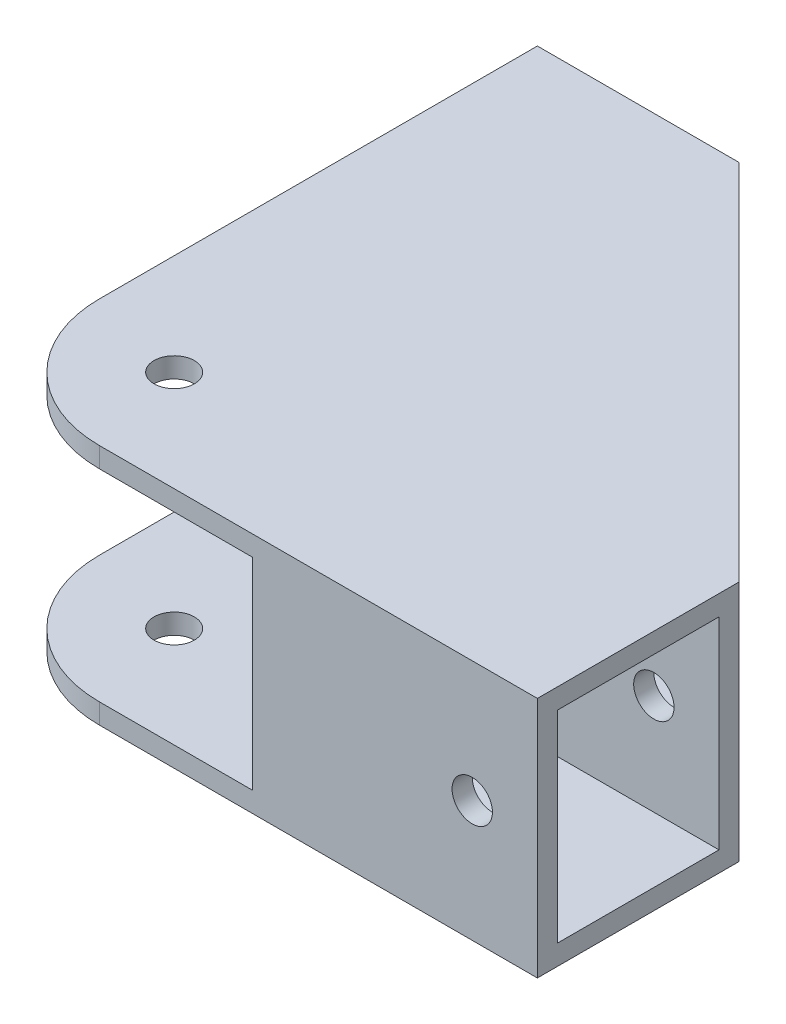
ISO-10303-21;
HEADER;
FILE_DESCRIPTION(('STEP AP214'),'2;1');
FILE_NAME('part.step','',(''),(''),'','','');
FILE_SCHEMA(('AUTOMOTIVE_DESIGN { 1 0 10303 214 1 1 1 1 }'));
ENDSEC;
DATA;
#1=APPLICATION_CONTEXT('core data for automotive mechanical design processes');
#2=APPLICATION_PROTOCOL_DEFINITION('international standard','automotive_design',2000,#1);
#3=PRODUCT_CONTEXT('',#1,'mechanical');
#4=PRODUCT('Part','Part','',(#3));
#5=PRODUCT_RELATED_PRODUCT_CATEGORY('part','',(#4));
#6=PRODUCT_DEFINITION_FORMATION('','',#4);
#7=PRODUCT_DEFINITION_CONTEXT('part definition',#1,'design');
#8=PRODUCT_DEFINITION('design','',#6,#7);
#9=PRODUCT_DEFINITION_SHAPE('','',#8);
#10=(LENGTH_UNIT() NAMED_UNIT(*) SI_UNIT(.MILLI.,.METRE.));
#11=(NAMED_UNIT(*) PLANE_ANGLE_UNIT() SI_UNIT($,.RADIAN.));
#12=(NAMED_UNIT(*) SI_UNIT($,.STERADIAN.) SOLID_ANGLE_UNIT());
#13=UNCERTAINTY_MEASURE_WITH_UNIT(LENGTH_MEASURE(1.E-05),#10,'distance_accuracy_value','');
#14=(GEOMETRIC_REPRESENTATION_CONTEXT(3) GLOBAL_UNCERTAINTY_ASSIGNED_CONTEXT((#13)) GLOBAL_UNIT_ASSIGNED_CONTEXT((#10,
#11,#12)) REPRESENTATION_CONTEXT('',''));
#15=CARTESIAN_POINT('',(0.,0.,0.));
#16=DIRECTION('',(0.,0.,1.));
#17=DIRECTION('',(1.,0.,0.));
#18=AXIS2_PLACEMENT_3D('',#15,#16,#17);
#19=CARTESIAN_POINT('',(-57.15,38.1,-31.75));
#20=DIRECTION('',(0.,0.,1.));
#21=DIRECTION('',(1.,0.,0.));
#22=AXIS2_PLACEMENT_3D('',#19,#20,#21);
#23=PLANE('',#22);
#24=CARTESIAN_POINT('',(-10.25,19.05,-31.75));
#25=DIRECTION('',(0.,0.,1.));
#26=DIRECTION('',(1.,0.,0.));
#27=AXIS2_PLACEMENT_3D('',#24,#25,#26);
#28=CIRCLE('',#27,3.175);
#29=CARTESIAN_POINT('',(-7.075,19.05,-31.75));
#30=VERTEX_POINT('',#29);
#31=EDGE_CURVE('E247',#30,#30,#28,.F.);
#32=ORIENTED_EDGE('',*,*,#31,.F.);
#33=EDGE_LOOP('',(#32));
#34=FACE_BOUND('',#33,.T.);
#35=DIRECTION('',(1.,0.,0.));
#36=VECTOR('',#35,1.);
#37=CARTESIAN_POINT('',(-57.15,3.17500000000001,-31.75));
#38=LINE('',#37,#36);
#39=CARTESIAN_POINT('',(-57.15,3.17500000000002,-31.75));
#40=VERTEX_POINT('',#39);
#41=CARTESIAN_POINT('',(0.,3.17500000000002,-31.75));
#42=VERTEX_POINT('',#41);
#43=EDGE_CURVE('E205',#40,#42,#38,.T.);
#44=ORIENTED_EDGE('',*,*,#43,.F.);
#45=DIRECTION('',(0.,-1.,0.));
#46=VECTOR('',#45,1.);
#47=CARTESIAN_POINT('',(-57.15,38.1,-31.75));
#48=LINE('',#47,#46);
#49=CARTESIAN_POINT('',(-57.15,34.925,-31.75));
#50=VERTEX_POINT('',#49);
#51=EDGE_CURVE('E197',#50,#40,#48,.T.);
#52=ORIENTED_EDGE('',*,*,#51,.F.);
#53=DIRECTION('',(1.,0.,0.));
#54=VECTOR('',#53,1.);
#55=CARTESIAN_POINT('',(-57.15,34.925,-31.75));
#56=LINE('',#55,#54);
#57=CARTESIAN_POINT('',(0.,34.925,-31.75));
#58=VERTEX_POINT('',#57);
#59=EDGE_CURVE('E182',#50,#58,#56,.T.);
#60=ORIENTED_EDGE('',*,*,#59,.T.);
#61=DIRECTION('',(0.,-1.,0.));
#62=VECTOR('',#61,1.);
#63=CARTESIAN_POINT('',(0.,38.1,-31.75));
#64=LINE('',#63,#62);
#65=EDGE_CURVE('E206',#58,#42,#64,.T.);
#66=ORIENTED_EDGE('',*,*,#65,.T.);
#67=EDGE_LOOP('',(#44,#52,#60,#66));
#68=FACE_BOUND('',#67,.T.);
#69=ADVANCED_FACE('F39',(#34,#68),#23,.F.);
#70=CARTESIAN_POINT('',(-57.15,38.1,-88.9));
#71=DIRECTION('',(-1.,0.,0.));
#72=DIRECTION('',(0.,0.,1.));
#73=AXIS2_PLACEMENT_3D('',#70,#71,#72);
#74=PLANE('',#73);
#75=CARTESIAN_POINT('',(-57.15,19.05,-78.65));
#76=DIRECTION('',(-1.,0.,0.));
#77=DIRECTION('',(0.,0.,1.));
#78=AXIS2_PLACEMENT_3D('',#75,#76,#77);
#79=CIRCLE('',#78,3.175);
#80=CARTESIAN_POINT('',(-57.15,19.05,-75.475));
#81=VERTEX_POINT('',#80);
#82=EDGE_CURVE('E242',#81,#81,#79,.F.);
#83=ORIENTED_EDGE('',*,*,#82,.F.);
#84=EDGE_LOOP('',(#83));
#85=FACE_BOUND('',#84,.T.);
#86=DIRECTION('',(0.,0.,1.));
#87=VECTOR('',#86,1.);
#88=CARTESIAN_POINT('',(-57.15,3.17500000000001,-88.9));
#89=LINE('',#88,#87);
#90=CARTESIAN_POINT('',(-57.15,3.17500000000002,-88.9));
#91=VERTEX_POINT('',#90);
#92=EDGE_CURVE('E375',#91,#40,#89,.T.);
#93=ORIENTED_EDGE('',*,*,#92,.F.);
#94=DIRECTION('',(0.,-1.,0.));
#95=VECTOR('',#94,1.);
#96=CARTESIAN_POINT('',(-57.15,38.1,-88.9));
#97=LINE('',#96,#95);
#98=CARTESIAN_POINT('',(-57.15,34.925,-88.9));
#99=VERTEX_POINT('',#98);
#100=EDGE_CURVE('E200',#99,#91,#97,.T.);
#101=ORIENTED_EDGE('',*,*,#100,.F.);
#102=DIRECTION('',(0.,0.,1.));
#103=VECTOR('',#102,1.);
#104=CARTESIAN_POINT('',(-57.15,34.925,-88.9));
#105=LINE('',#104,#103);
#106=EDGE_CURVE('E185',#99,#50,#105,.T.);
#107=ORIENTED_EDGE('',*,*,#106,.T.);
#108=ORIENTED_EDGE('',*,*,#51,.T.);
#109=EDGE_LOOP('',(#93,#101,#107,#108));
#110=FACE_BOUND('',#109,.T.);
#111=ADVANCED_FACE('F196',(#85,#110),#74,.F.);
#112=CARTESIAN_POINT('',(-129.559838907699,34.925,-3.175));
#113=DIRECTION('',(0.,0.,1.));
#114=DIRECTION('',(1.,0.,0.));
#115=AXIS2_PLACEMENT_3D('',#112,#113,#114);
#116=PLANE('',#115);
#117=CARTESIAN_POINT('',(-10.25,19.05,-3.175));
#118=DIRECTION('',(0.,0.,1.));
#119=DIRECTION('',(1.,0.,0.));
#120=AXIS2_PLACEMENT_3D('',#117,#118,#119);
#121=CIRCLE('',#120,3.175);
#122=CARTESIAN_POINT('',(-7.075,19.05,-3.175));
#123=VERTEX_POINT('',#122);
#124=EDGE_CURVE('E246',#123,#123,#121,.T.);
#125=ORIENTED_EDGE('',*,*,#124,.T.);
#126=EDGE_LOOP('',(#125));
#127=FACE_BOUND('',#126,.T.);
#128=DIRECTION('',(1.,0.,0.));
#129=VECTOR('',#128,1.);
#130=CARTESIAN_POINT('',(-129.559838907699,3.175,-3.175));
#131=LINE('',#130,#129);
#132=CARTESIAN_POINT('',(-41.6638474551887,3.175,-3.175));
#133=VERTEX_POINT('',#132);
#134=CARTESIAN_POINT('',(0.,3.175,-3.175));
#135=VERTEX_POINT('',#134);
#136=EDGE_CURVE('E335',#133,#135,#131,.T.);
#137=ORIENTED_EDGE('',*,*,#136,.F.);
#138=DIRECTION('',(0.,1.,0.));
#139=VECTOR('',#138,1.);
#140=CARTESIAN_POINT('',(-41.6638474551887,34.925,-3.175));
#141=LINE('',#140,#139);
#142=CARTESIAN_POINT('',(-41.6638474551887,34.925,-3.175));
#143=VERTEX_POINT('',#142);
#144=EDGE_CURVE('E259',#133,#143,#141,.T.);
#145=ORIENTED_EDGE('',*,*,#144,.T.);
#146=DIRECTION('',(1.,0.,0.));
#147=VECTOR('',#146,1.);
#148=CARTESIAN_POINT('',(-129.559838907699,34.925,-3.175));
#149=LINE('',#148,#147);
#150=CARTESIAN_POINT('',(0.,34.925,-3.175));
#151=VERTEX_POINT('',#150);
#152=EDGE_CURVE('E277',#143,#151,#149,.T.);
#153=ORIENTED_EDGE('',*,*,#152,.T.);
#154=DIRECTION('',(0.,-1.,0.));
#155=VECTOR('',#154,1.);
#156=CARTESIAN_POINT('',(0.,34.925,-3.175));
#157=LINE('',#156,#155);
#158=EDGE_CURVE('E323',#151,#135,#157,.T.);
#159=ORIENTED_EDGE('',*,*,#158,.T.);
#160=EDGE_LOOP('',(#137,#145,#153,#159));
#161=FACE_BOUND('',#160,.T.);
#162=ADVANCED_FACE('F443',(#127,#161),#116,.F.);
#163=CARTESIAN_POINT('',(-88.9,38.1,0.));
#164=DIRECTION('',(1.,0.,0.));
#165=DIRECTION('',(0.,0.,-1.));
#166=AXIS2_PLACEMENT_3D('',#163,#164,#165);
#167=PLANE('',#166);
#168=CARTESIAN_POINT('',(-88.9,19.05,-78.65));
#169=DIRECTION('',(-1.,0.,0.));
#170=DIRECTION('',(0.,0.,1.));
#171=AXIS2_PLACEMENT_3D('',#168,#169,#170);
#172=CIRCLE('',#171,3.175);
#173=CARTESIAN_POINT('',(-88.9,19.05,-75.475));
#174=VERTEX_POINT('',#173);
#175=EDGE_CURVE('E396',#174,#174,#172,.T.);
#176=ORIENTED_EDGE('',*,*,#175,.F.);
#177=EDGE_LOOP('',(#176));
#178=FACE_BOUND('',#177,.T.);
#179=DIRECTION('',(0.,1.,0.));
#180=VECTOR('',#179,1.);
#181=CARTESIAN_POINT('',(-88.9,0.,-44.0611525448112));
#182=LINE('',#181,#180);
#183=CARTESIAN_POINT('',(-88.9,3.175,-44.0611525448112));
#184=VERTEX_POINT('',#183);
#185=CARTESIAN_POINT('',(-88.9,34.925,-44.0611525448112));
#186=VERTEX_POINT('',#185);
#187=EDGE_CURVE('E262',#184,#186,#182,.T.);
#188=ORIENTED_EDGE('',*,*,#187,.T.);
#189=DIRECTION('',(0.,0.,-1.));
#190=VECTOR('',#189,1.);
#191=CARTESIAN_POINT('',(-88.9,34.925,-28.575));
#192=LINE('',#191,#190);
#193=CARTESIAN_POINT('',(-88.9,34.925,-20.));
#194=VERTEX_POINT('',#193);
#195=EDGE_CURVE('E318',#194,#186,#192,.T.);
#196=ORIENTED_EDGE('',*,*,#195,.F.);
#197=DIRECTION('',(0.,-1.,0.));
#198=VECTOR('',#197,1.);
#199=CARTESIAN_POINT('',(-88.9,38.1,-20.));
#200=LINE('',#199,#198);
#201=CARTESIAN_POINT('',(-88.9,38.1,-20.));
#202=VERTEX_POINT('',#201);
#203=EDGE_CURVE('E222',#194,#202,#200,.F.);
#204=ORIENTED_EDGE('',*,*,#203,.T.);
#205=DIRECTION('',(0.,0.,1.));
#206=VECTOR('',#205,1.);
#207=CARTESIAN_POINT('',(-88.9,38.1,0.));
#208=LINE('',#207,#206);
#209=CARTESIAN_POINT('',(-88.9,38.1,-88.9));
#210=VERTEX_POINT('',#209);
#211=EDGE_CURVE('E344',#210,#202,#208,.T.);
#212=ORIENTED_EDGE('',*,*,#211,.F.);
#213=DIRECTION('',(0.,-1.,0.));
#214=VECTOR('',#213,1.);
#215=CARTESIAN_POINT('',(-88.9,38.1,-88.9));
#216=LINE('',#215,#214);
#217=CARTESIAN_POINT('',(-88.9,0.,-88.9));
#218=VERTEX_POINT('',#217);
#219=EDGE_CURVE('E358',#210,#218,#216,.T.);
#220=ORIENTED_EDGE('',*,*,#219,.T.);
#221=DIRECTION('',(0.,0.,1.));
#222=VECTOR('',#221,1.);
#223=CARTESIAN_POINT('',(-88.9,0.,0.));
#224=LINE('',#223,#222);
#225=CARTESIAN_POINT('',(-88.9,0.,-20.));
#226=VERTEX_POINT('',#225);
#227=EDGE_CURVE('E353',#218,#226,#224,.T.);
#228=ORIENTED_EDGE('',*,*,#227,.T.);
#229=DIRECTION('',(0.,-1.,0.));
#230=VECTOR('',#229,1.);
#231=CARTESIAN_POINT('',(-88.9,38.1,-20.));
#232=LINE('',#231,#230);
#233=CARTESIAN_POINT('',(-88.9,3.175,-20.));
#234=VERTEX_POINT('',#233);
#235=EDGE_CURVE('E224',#226,#234,#232,.F.);
#236=ORIENTED_EDGE('',*,*,#235,.T.);
#237=DIRECTION('',(0.,0.,1.));
#238=VECTOR('',#237,1.);
#239=CARTESIAN_POINT('',(-88.9,3.175,-3.175));
#240=LINE('',#239,#238);
#241=EDGE_CURVE('E315',#184,#234,#240,.T.);
#242=ORIENTED_EDGE('',*,*,#241,.F.);
#243=EDGE_LOOP('',(#188,#196,#204,#212,#220,#228,#236,#242));
#244=FACE_BOUND('',#243,.T.);
#245=ADVANCED_FACE('F518',(#178,#244),#167,.F.);
#246=CARTESIAN_POINT('',(0.,38.1,0.));
#247=DIRECTION('',(0.,0.,-1.));
#248=DIRECTION('',(-1.,0.,0.));
#249=AXIS2_PLACEMENT_3D('',#246,#247,#248);
#250=PLANE('',#249);
#251=CARTESIAN_POINT('',(-10.25,19.05,0.));
#252=DIRECTION('',(0.,0.,1.));
#253=DIRECTION('',(1.,0.,0.));
#254=AXIS2_PLACEMENT_3D('',#251,#252,#253);
#255=CIRCLE('',#254,3.175);
#256=CARTESIAN_POINT('',(-7.075,19.05,0.));
#257=VERTEX_POINT('',#256);
#258=EDGE_CURVE('E385',#257,#257,#255,.T.);
#259=ORIENTED_EDGE('',*,*,#258,.F.);
#260=EDGE_LOOP('',(#259));
#261=FACE_BOUND('',#260,.T.);
#262=DIRECTION('',(0.,-1.,0.));
#263=VECTOR('',#262,1.);
#264=CARTESIAN_POINT('',(-44.8388474551888,0.,0.));
#265=LINE('',#264,#263);
#266=CARTESIAN_POINT('',(-44.8388474551888,34.925,0.));
#267=VERTEX_POINT('',#266);
#268=CARTESIAN_POINT('',(-44.8388474551888,3.175,0.));
#269=VERTEX_POINT('',#268);
#270=EDGE_CURVE('E256',#267,#269,#265,.T.);
#271=ORIENTED_EDGE('',*,*,#270,.T.);
#272=DIRECTION('',(1.,0.,0.));
#273=VECTOR('',#272,1.);
#274=CARTESIAN_POINT('',(-60.325,3.175,0.));
#275=LINE('',#274,#273);
#276=CARTESIAN_POINT('',(-68.9,3.175,0.));
#277=VERTEX_POINT('',#276);
#278=EDGE_CURVE('E285',#277,#269,#275,.T.);
#279=ORIENTED_EDGE('',*,*,#278,.F.);
#280=DIRECTION('',(0.,-1.,0.));
#281=VECTOR('',#280,1.);
#282=CARTESIAN_POINT('',(-68.9,38.1,0.));
#283=LINE('',#282,#281);
#284=CARTESIAN_POINT('',(-68.9,0.,0.));
#285=VERTEX_POINT('',#284);
#286=EDGE_CURVE('E217',#277,#285,#283,.T.);
#287=ORIENTED_EDGE('',*,*,#286,.T.);
#288=DIRECTION('',(1.,0.,0.));
#289=VECTOR('',#288,1.);
#290=CARTESIAN_POINT('',(0.,0.,0.));
#291=LINE('',#290,#289);
#292=CARTESIAN_POINT('',(0.,0.,0.));
#293=VERTEX_POINT('',#292);
#294=EDGE_CURVE('E342',#285,#293,#291,.T.);
#295=ORIENTED_EDGE('',*,*,#294,.T.);
#296=DIRECTION('',(0.,-1.,0.));
#297=VECTOR('',#296,1.);
#298=CARTESIAN_POINT('',(0.,38.1,0.));
#299=LINE('',#298,#297);
#300=CARTESIAN_POINT('',(0.,38.1,0.));
#301=VERTEX_POINT('',#300);
#302=EDGE_CURVE('E349',#301,#293,#299,.T.);
#303=ORIENTED_EDGE('',*,*,#302,.F.);
#304=DIRECTION('',(1.,0.,0.));
#305=VECTOR('',#304,1.);
#306=CARTESIAN_POINT('',(0.,38.1,0.));
#307=LINE('',#306,#305);
#308=CARTESIAN_POINT('',(-68.9,38.1,0.));
#309=VERTEX_POINT('',#308);
#310=EDGE_CURVE('E347',#309,#301,#307,.T.);
#311=ORIENTED_EDGE('',*,*,#310,.F.);
#312=DIRECTION('',(0.,-1.,0.));
#313=VECTOR('',#312,1.);
#314=CARTESIAN_POINT('',(-68.9,38.1,0.));
#315=LINE('',#314,#313);
#316=CARTESIAN_POINT('',(-68.9,34.925,0.));
#317=VERTEX_POINT('',#316);
#318=EDGE_CURVE('E214',#309,#317,#315,.T.);
#319=ORIENTED_EDGE('',*,*,#318,.T.);
#320=DIRECTION('',(-1.,0.,0.));
#321=VECTOR('',#320,1.);
#322=CARTESIAN_POINT('',(-85.725,34.925,0.));
#323=LINE('',#322,#321);
#324=EDGE_CURVE('E275',#267,#317,#323,.T.);
#325=ORIENTED_EDGE('',*,*,#324,.F.);
#326=EDGE_LOOP('',(#271,#279,#287,#295,#303,#311,#319,#325));
#327=FACE_BOUND('',#326,.T.);
#328=ADVANCED_FACE('F284',(#261,#327),#250,.F.);
#329=CARTESIAN_POINT('',(-85.725,3.175,40.6598389076986));
#330=DIRECTION('',(-1.,0.,0.));
#331=DIRECTION('',(0.,0.,1.));
#332=AXIS2_PLACEMENT_3D('',#329,#330,#331);
#333=PLANE('',#332);
#334=CARTESIAN_POINT('',(-85.725,19.05,-78.65));
#335=DIRECTION('',(-1.,0.,0.));
#336=DIRECTION('',(0.,0.,1.));
#337=AXIS2_PLACEMENT_3D('',#334,#335,#336);
#338=CIRCLE('',#337,3.175);
#339=CARTESIAN_POINT('',(-85.725,19.05,-75.475));
#340=VERTEX_POINT('',#339);
#341=EDGE_CURVE('E241',#340,#340,#338,.T.);
#342=ORIENTED_EDGE('',*,*,#341,.T.);
#343=EDGE_LOOP('',(#342));
#344=FACE_BOUND('',#343,.T.);
#345=DIRECTION('',(0.,0.,-1.));
#346=VECTOR('',#345,1.);
#347=CARTESIAN_POINT('',(-85.725,34.925,40.6598389076986));
#348=LINE('',#347,#346);
#349=CARTESIAN_POINT('',(-85.725,34.925,-47.2361525448113));
#350=VERTEX_POINT('',#349);
#351=CARTESIAN_POINT('',(-85.725,34.925,-88.9));
#352=VERTEX_POINT('',#351);
#353=EDGE_CURVE('E293',#350,#352,#348,.T.);
#354=ORIENTED_EDGE('',*,*,#353,.F.);
#355=DIRECTION('',(0.,-1.,0.));
#356=VECTOR('',#355,1.);
#357=CARTESIAN_POINT('',(-85.725,3.175,-47.2361525448113));
#358=LINE('',#357,#356);
#359=CARTESIAN_POINT('',(-85.725,3.175,-47.2361525448113));
#360=VERTEX_POINT('',#359);
#361=EDGE_CURVE('E265',#350,#360,#358,.T.);
#362=ORIENTED_EDGE('',*,*,#361,.T.);
#363=DIRECTION('',(0.,0.,-1.));
#364=VECTOR('',#363,1.);
#365=CARTESIAN_POINT('',(-85.725,3.175,40.6598389076986));
#366=LINE('',#365,#364);
#367=CARTESIAN_POINT('',(-85.725,3.175,-88.9));
#368=VERTEX_POINT('',#367);
#369=EDGE_CURVE('E312',#360,#368,#366,.T.);
#370=ORIENTED_EDGE('',*,*,#369,.T.);
#371=DIRECTION('',(0.,1.,0.));
#372=VECTOR('',#371,1.);
#373=CARTESIAN_POINT('',(-85.725,3.175,-88.9));
#374=LINE('',#373,#372);
#375=EDGE_CURVE('E304',#368,#352,#374,.T.);
#376=ORIENTED_EDGE('',*,*,#375,.T.);
#377=EDGE_LOOP('',(#354,#362,#370,#376));
#378=FACE_BOUND('',#377,.T.);
#379=ADVANCED_FACE('F501',(#344,#378),#333,.F.);
#380=CARTESIAN_POINT('',(-129.559838907699,3.175,-28.575));
#381=DIRECTION('',(0.,0.,-1.));
#382=DIRECTION('',(-1.,0.,0.));
#383=AXIS2_PLACEMENT_3D('',#380,#381,#382);
#384=PLANE('',#383);
#385=CARTESIAN_POINT('',(-10.25,19.05,-28.575));
#386=DIRECTION('',(0.,0.,-1.));
#387=DIRECTION('',(-1.,0.,0.));
#388=AXIS2_PLACEMENT_3D('',#385,#386,#387);
#389=CIRCLE('',#388,3.175);
#390=CARTESIAN_POINT('',(-13.425,19.05,-28.575));
#391=VERTEX_POINT('',#390);
#392=EDGE_CURVE('E243',#391,#391,#389,.T.);
#393=ORIENTED_EDGE('',*,*,#392,.T.);
#394=EDGE_LOOP('',(#393));
#395=FACE_BOUND('',#394,.T.);
#396=DIRECTION('',(1.,0.,0.));
#397=VECTOR('',#396,1.);
#398=CARTESIAN_POINT('',(-129.559838907699,34.925,-28.575));
#399=LINE('',#398,#397);
#400=CARTESIAN_POINT('',(-55.325,34.925,-28.575));
#401=VERTEX_POINT('',#400);
#402=CARTESIAN_POINT('',(0.,34.925,-28.575));
#403=VERTEX_POINT('',#402);
#404=EDGE_CURVE('E319',#401,#403,#399,.T.);
#405=ORIENTED_EDGE('',*,*,#404,.F.);
#406=DIRECTION('',(0.,-1.,0.));
#407=VECTOR('',#406,1.);
#408=CARTESIAN_POINT('',(-55.325,3.175,-28.575));
#409=LINE('',#408,#407);
#410=CARTESIAN_POINT('',(-55.325,3.175,-28.575));
#411=VERTEX_POINT('',#410);
#412=EDGE_CURVE('E232',#401,#411,#409,.T.);
#413=ORIENTED_EDGE('',*,*,#412,.T.);
#414=DIRECTION('',(1.,0.,0.));
#415=VECTOR('',#414,1.);
#416=CARTESIAN_POINT('',(-129.559838907699,3.175,-28.575));
#417=LINE('',#416,#415);
#418=CARTESIAN_POINT('',(0.,3.175,-28.575));
#419=VERTEX_POINT('',#418);
#420=EDGE_CURVE('E333',#411,#419,#417,.T.);
#421=ORIENTED_EDGE('',*,*,#420,.T.);
#422=DIRECTION('',(0.,1.,0.));
#423=VECTOR('',#422,1.);
#424=CARTESIAN_POINT('',(0.,3.175,-28.575));
#425=LINE('',#424,#423);
#426=EDGE_CURVE('E329',#419,#403,#425,.T.);
#427=ORIENTED_EDGE('',*,*,#426,.T.);
#428=EDGE_LOOP('',(#405,#413,#421,#427));
#429=FACE_BOUND('',#428,.T.);
#430=ADVANCED_FACE('F452',(#395,#429),#384,.F.);
#431=CARTESIAN_POINT('',(0.,38.1,-31.75));
#432=DIRECTION('',(-1.,0.,0.));
#433=DIRECTION('',(0.,0.,1.));
#434=AXIS2_PLACEMENT_3D('',#431,#432,#433);
#435=PLANE('',#434);
#436=ORIENTED_EDGE('',*,*,#158,.F.);
#437=DIRECTION('',(0.,0.,1.));
#438=VECTOR('',#437,1.);
#439=CARTESIAN_POINT('',(0.,34.925,-28.575));
#440=LINE('',#439,#438);
#441=EDGE_CURVE('E291',#403,#151,#440,.T.);
#442=ORIENTED_EDGE('',*,*,#441,.F.);
#443=ORIENTED_EDGE('',*,*,#426,.F.);
#444=DIRECTION('',(0.,0.,-1.));
#445=VECTOR('',#444,1.);
#446=CARTESIAN_POINT('',(0.,3.175,-3.175));
#447=LINE('',#446,#445);
#448=EDGE_CURVE('E326',#135,#419,#447,.T.);
#449=ORIENTED_EDGE('',*,*,#448,.F.);
#450=EDGE_LOOP('',(#436,#442,#443,#449));
#451=FACE_BOUND('',#450,.T.);
#452=DIRECTION('',(0.,0.,-1.));
#453=VECTOR('',#452,1.);
#454=CARTESIAN_POINT('',(0.,0.,-31.75));
#455=LINE('',#454,#453);
#456=CARTESIAN_POINT('',(0.,0.,-31.75));
#457=VERTEX_POINT('',#456);
#458=EDGE_CURVE('E321',#293,#457,#455,.T.);
#459=ORIENTED_EDGE('',*,*,#458,.T.);
#460=DIRECTION('',(0.,-1.,0.));
#461=VECTOR('',#460,1.);
#462=CARTESIAN_POINT('',(0.,3.17500000000001,-31.75));
#463=LINE('',#462,#461);
#464=EDGE_CURVE('E383',#42,#457,#463,.T.);
#465=ORIENTED_EDGE('',*,*,#464,.F.);
#466=ORIENTED_EDGE('',*,*,#65,.F.);
#467=CARTESIAN_POINT('',(0.,38.1,-31.75));
#468=VERTEX_POINT('',#467);
#469=EDGE_CURVE('E209',#468,#58,#64,.T.);
#470=ORIENTED_EDGE('',*,*,#469,.F.);
#471=DIRECTION('',(0.,0.,-1.));
#472=VECTOR('',#471,1.);
#473=CARTESIAN_POINT('',(0.,38.1,-31.75));
#474=LINE('',#473,#472);
#475=EDGE_CURVE('E338',#301,#468,#474,.T.);
#476=ORIENTED_EDGE('',*,*,#475,.F.);
#477=ORIENTED_EDGE('',*,*,#302,.T.);
#478=EDGE_LOOP('',(#459,#465,#466,#470,#476,#477));
#479=FACE_BOUND('',#478,.T.);
#480=ADVANCED_FACE('F449',(#451,#479),#435,.F.);
#481=CARTESIAN_POINT('',(-88.9,38.1,-88.9));
#482=DIRECTION('',(0.,0.,1.));
#483=DIRECTION('',(1.,0.,0.));
#484=AXIS2_PLACEMENT_3D('',#481,#482,#483);
#485=PLANE('',#484);
#486=DIRECTION('',(-1.,0.,0.));
#487=VECTOR('',#486,1.);
#488=CARTESIAN_POINT('',(-60.325,3.175,-88.9));
#489=LINE('',#488,#487);
#490=CARTESIAN_POINT('',(-60.325,3.175,-88.9));
#491=VERTEX_POINT('',#490);
#492=EDGE_CURVE('E301',#491,#368,#489,.T.);
#493=ORIENTED_EDGE('',*,*,#492,.F.);
#494=DIRECTION('',(0.,-1.,0.));
#495=VECTOR('',#494,1.);
#496=CARTESIAN_POINT('',(-60.325,34.925,-88.9));
#497=LINE('',#496,#495);
#498=CARTESIAN_POINT('',(-60.325,34.925,-88.9));
#499=VERTEX_POINT('',#498);
#500=EDGE_CURVE('E298',#499,#491,#497,.T.);
#501=ORIENTED_EDGE('',*,*,#500,.F.);
#502=DIRECTION('',(1.,0.,0.));
#503=VECTOR('',#502,1.);
#504=CARTESIAN_POINT('',(-85.725,34.925,-88.9));
#505=LINE('',#504,#503);
#506=EDGE_CURVE('E307',#352,#499,#505,.T.);
#507=ORIENTED_EDGE('',*,*,#506,.F.);
#508=ORIENTED_EDGE('',*,*,#375,.F.);
#509=EDGE_LOOP('',(#493,#501,#507,#508));
#510=FACE_BOUND('',#509,.T.);
#511=DIRECTION('',(-1.,0.,0.));
#512=VECTOR('',#511,1.);
#513=CARTESIAN_POINT('',(-88.9,0.,-88.9));
#514=LINE('',#513,#512);
#515=CARTESIAN_POINT('',(-57.15,0.,-88.9));
#516=VERTEX_POINT('',#515);
#517=EDGE_CURVE('E351',#516,#218,#514,.T.);
#518=ORIENTED_EDGE('',*,*,#517,.T.);
#519=ORIENTED_EDGE('',*,*,#219,.F.);
#520=DIRECTION('',(-1.,0.,0.));
#521=VECTOR('',#520,1.);
#522=CARTESIAN_POINT('',(-88.9,38.1,-88.9));
#523=LINE('',#522,#521);
#524=CARTESIAN_POINT('',(-57.15,38.1,-88.9));
#525=VERTEX_POINT('',#524);
#526=EDGE_CURVE('E341',#525,#210,#523,.T.);
#527=ORIENTED_EDGE('',*,*,#526,.F.);
#528=EDGE_CURVE('E207',#525,#99,#97,.T.);
#529=ORIENTED_EDGE('',*,*,#528,.T.);
#530=ORIENTED_EDGE('',*,*,#100,.T.);
#531=DIRECTION('',(0.,-1.,0.));
#532=VECTOR('',#531,1.);
#533=CARTESIAN_POINT('',(-57.15,3.17500000000001,-88.9));
#534=LINE('',#533,#532);
#535=EDGE_CURVE('E368',#91,#516,#534,.T.);
#536=ORIENTED_EDGE('',*,*,#535,.T.);
#537=EDGE_LOOP('',(#518,#519,#527,#529,#530,#536));
#538=FACE_BOUND('',#537,.T.);
#539=ADVANCED_FACE('F366',(#510,#538),#485,.F.);
#540=CARTESIAN_POINT('',(0.,38.1,0.));
#541=DIRECTION('',(0.,-1.,0.));
#542=DIRECTION('',(0.,0.,-1.));
#543=AXIS2_PLACEMENT_3D('',#540,#541,#542);
#544=PLANE('',#543);
#545=DIRECTION('',(-0.707106781186547,0.,-0.707106781186548));
#546=VECTOR('',#545,1.);
#547=CARTESIAN_POINT('',(-57.15,38.1,-88.9));
#548=LINE('',#547,#546);
#549=EDGE_CURVE('E202',#468,#525,#548,.T.);
#550=ORIENTED_EDGE('',*,*,#549,.T.);
#551=ORIENTED_EDGE('',*,*,#526,.T.);
#552=ORIENTED_EDGE('',*,*,#211,.T.);
#553=CARTESIAN_POINT('',(-68.9,38.1,-20.));
#554=DIRECTION('',(0.,-1.,0.));
#555=DIRECTION('',(0.,0.,-1.));
#556=AXIS2_PLACEMENT_3D('',#553,#554,#555);
#557=CIRCLE('',#556,20.);
#558=EDGE_CURVE('E230',#202,#309,#557,.F.);
#559=ORIENTED_EDGE('',*,*,#558,.T.);
#560=ORIENTED_EDGE('',*,*,#310,.T.);
#561=ORIENTED_EDGE('',*,*,#475,.T.);
#562=EDGE_LOOP('',(#550,#551,#552,#559,#560,#561));
#563=FACE_BOUND('',#562,.T.);
#564=CARTESIAN_POINT('',(-73.025,38.1,-15.875));
#565=DIRECTION('',(0.,-1.,0.));
#566=DIRECTION('',(0.,0.,-1.));
#567=AXIS2_PLACEMENT_3D('',#564,#565,#566);
#568=CIRCLE('',#567,3.175);
#569=CARTESIAN_POINT('',(-73.025,38.1,-19.05));
#570=VERTEX_POINT('',#569);
#571=EDGE_CURVE('E237',#570,#570,#568,.T.);
#572=ORIENTED_EDGE('',*,*,#571,.T.);
#573=EDGE_LOOP('',(#572));
#574=FACE_BOUND('',#573,.T.);
#575=ADVANCED_FACE('F411',(#563,#574),#544,.F.);
#576=CARTESIAN_POINT('',(0.,0.,0.));
#577=DIRECTION('',(0.,-1.,0.));
#578=DIRECTION('',(0.,0.,-1.));
#579=AXIS2_PLACEMENT_3D('',#576,#577,#578);
#580=PLANE('',#579);
#581=ORIENTED_EDGE('',*,*,#517,.F.);
#582=DIRECTION('',(-0.707106781186547,0.,-0.707106781186548));
#583=VECTOR('',#582,1.);
#584=CARTESIAN_POINT('',(-57.15,0.,-88.9));
#585=LINE('',#584,#583);
#586=EDGE_CURVE('E382',#457,#516,#585,.T.);
#587=ORIENTED_EDGE('',*,*,#586,.F.);
#588=ORIENTED_EDGE('',*,*,#458,.F.);
#589=ORIENTED_EDGE('',*,*,#294,.F.);
#590=CARTESIAN_POINT('',(-68.9,0.,-20.));
#591=DIRECTION('',(0.,-1.,0.));
#592=DIRECTION('',(0.,0.,-1.));
#593=AXIS2_PLACEMENT_3D('',#590,#591,#592);
#594=CIRCLE('',#593,20.);
#595=EDGE_CURVE('E220',#285,#226,#594,.T.);
#596=ORIENTED_EDGE('',*,*,#595,.T.);
#597=ORIENTED_EDGE('',*,*,#227,.F.);
#598=EDGE_LOOP('',(#581,#587,#588,#589,#596,#597));
#599=FACE_BOUND('',#598,.T.);
#600=CARTESIAN_POINT('',(-73.025,0.,-15.875));
#601=DIRECTION('',(0.,-1.,0.));
#602=DIRECTION('',(0.,0.,-1.));
#603=AXIS2_PLACEMENT_3D('',#600,#601,#602);
#604=CIRCLE('',#603,3.175);
#605=CARTESIAN_POINT('',(-73.025,0.,-19.05));
#606=VERTEX_POINT('',#605);
#607=EDGE_CURVE('E404',#606,#606,#604,.T.);
#608=ORIENTED_EDGE('',*,*,#607,.F.);
#609=EDGE_LOOP('',(#608));
#610=FACE_BOUND('',#609,.T.);
#611=ADVANCED_FACE('F424',(#599,#610),#580,.T.);
#612=CARTESIAN_POINT('',(-129.559838907699,34.925,-28.575));
#613=DIRECTION('',(0.,1.,0.));
#614=DIRECTION('',(0.,0.,1.));
#615=AXIS2_PLACEMENT_3D('',#612,#613,#614);
#616=PLANE('',#615);
#617=CARTESIAN_POINT('',(-73.025,34.925,-15.875));
#618=DIRECTION('',(0.,1.,0.));
#619=DIRECTION('',(0.,0.,1.));
#620=AXIS2_PLACEMENT_3D('',#617,#618,#619);
#621=CIRCLE('',#620,3.175);
#622=CARTESIAN_POINT('',(-73.025,34.925,-12.7));
#623=VERTEX_POINT('',#622);
#624=EDGE_CURVE('E236',#623,#623,#621,.T.);
#625=ORIENTED_EDGE('',*,*,#624,.T.);
#626=EDGE_LOOP('',(#625));
#627=FACE_BOUND('',#626,.T.);
#628=ORIENTED_EDGE('',*,*,#324,.T.);
#629=CARTESIAN_POINT('',(-68.9,34.925,-20.));
#630=DIRECTION('',(0.,1.,0.));
#631=DIRECTION('',(0.,0.,1.));
#632=AXIS2_PLACEMENT_3D('',#629,#630,#631);
#633=CIRCLE('',#632,20.);
#634=EDGE_CURVE('E228',#317,#194,#633,.F.);
#635=ORIENTED_EDGE('',*,*,#634,.T.);
#636=ORIENTED_EDGE('',*,*,#195,.T.);
#637=DIRECTION('',(0.707106781186543,0.,-0.707106781186552));
#638=VECTOR('',#637,1.);
#639=CARTESIAN_POINT('',(-116.972995726255,34.925,-15.9881568185562));
#640=LINE('',#639,#638);
#641=EDGE_CURVE('E48',#186,#350,#640,.T.);
#642=ORIENTED_EDGE('',*,*,#641,.T.);
#643=ORIENTED_EDGE('',*,*,#353,.T.);
#644=ORIENTED_EDGE('',*,*,#506,.T.);
#645=DIRECTION('',(0.,0.,-1.));
#646=VECTOR('',#645,1.);
#647=CARTESIAN_POINT('',(-60.325,34.925,40.6598389076986));
#648=LINE('',#647,#646);
#649=CARTESIAN_POINT('',(-60.325,34.925,-33.575));
#650=VERTEX_POINT('',#649);
#651=EDGE_CURVE('E289',#650,#499,#648,.T.);
#652=ORIENTED_EDGE('',*,*,#651,.F.);
#653=CARTESIAN_POINT('',(-55.325,34.925,-33.575));
#654=DIRECTION('',(0.,1.,0.));
#655=DIRECTION('',(0.,0.,1.));
#656=AXIS2_PLACEMENT_3D('',#653,#654,#655);
#657=CIRCLE('',#656,5.);
#658=EDGE_CURVE('E254',#650,#401,#657,.T.);
#659=ORIENTED_EDGE('',*,*,#658,.T.);
#660=ORIENTED_EDGE('',*,*,#404,.T.);
#661=ORIENTED_EDGE('',*,*,#441,.T.);
#662=ORIENTED_EDGE('',*,*,#152,.F.);
#663=DIRECTION('',(-0.707106781186555,0.,0.70710678118654));
#664=VECTOR('',#663,1.);
#665=CARTESIAN_POINT('',(-72.9118431814446,34.925,28.0729957262552));
#666=LINE('',#665,#664);
#667=EDGE_CURVE('E269',#143,#267,#666,.T.);
#668=ORIENTED_EDGE('',*,*,#667,.T.);
#669=EDGE_LOOP('',(#628,#635,#636,#642,#643,#644,#652,#659,#660,#661,#662,#668));
#670=FACE_BOUND('',#669,.T.);
#671=ADVANCED_FACE('F274',(#627,#670),#616,.F.);
#672=CARTESIAN_POINT('',(-129.559838907699,3.175,-3.175));
#673=DIRECTION('',(0.,-1.,0.));
#674=DIRECTION('',(0.,0.,-1.));
#675=AXIS2_PLACEMENT_3D('',#672,#673,#674);
#676=PLANE('',#675);
#677=CARTESIAN_POINT('',(-73.025,3.175,-15.875));
#678=DIRECTION('',(0.,-1.,0.));
#679=DIRECTION('',(0.,0.,-1.));
#680=AXIS2_PLACEMENT_3D('',#677,#678,#679);
#681=CIRCLE('',#680,3.175);
#682=CARTESIAN_POINT('',(-73.025,3.175,-19.05));
#683=VERTEX_POINT('',#682);
#684=EDGE_CURVE('E233',#683,#683,#681,.T.);
#685=ORIENTED_EDGE('',*,*,#684,.T.);
#686=EDGE_LOOP('',(#685));
#687=FACE_BOUND('',#686,.T.);
#688=ORIENTED_EDGE('',*,*,#241,.T.);
#689=CARTESIAN_POINT('',(-68.9,3.175,-20.));
#690=DIRECTION('',(0.,-1.,0.));
#691=DIRECTION('',(0.,0.,-1.));
#692=AXIS2_PLACEMENT_3D('',#689,#690,#691);
#693=CIRCLE('',#692,20.);
#694=EDGE_CURVE('E226',#234,#277,#693,.F.);
#695=ORIENTED_EDGE('',*,*,#694,.T.);
#696=ORIENTED_EDGE('',*,*,#278,.T.);
#697=DIRECTION('',(0.707106781186555,0.,-0.70710678118654));
#698=VECTOR('',#697,1.);
#699=CARTESIAN_POINT('',(-85.6118431814446,3.175,40.7729957262549));
#700=LINE('',#699,#698);
#701=EDGE_CURVE('E267',#269,#133,#700,.T.);
#702=ORIENTED_EDGE('',*,*,#701,.T.);
#703=ORIENTED_EDGE('',*,*,#136,.T.);
#704=ORIENTED_EDGE('',*,*,#448,.T.);
#705=ORIENTED_EDGE('',*,*,#420,.F.);
#706=CARTESIAN_POINT('',(-55.325,3.175,-33.575));
#707=DIRECTION('',(0.,-1.,0.));
#708=DIRECTION('',(0.,0.,-1.));
#709=AXIS2_PLACEMENT_3D('',#706,#707,#708);
#710=CIRCLE('',#709,5.);
#711=CARTESIAN_POINT('',(-60.325,3.175,-33.575));
#712=VERTEX_POINT('',#711);
#713=EDGE_CURVE('E252',#411,#712,#710,.T.);
#714=ORIENTED_EDGE('',*,*,#713,.T.);
#715=DIRECTION('',(0.,0.,-1.));
#716=VECTOR('',#715,1.);
#717=CARTESIAN_POINT('',(-60.325,3.175,40.6598389076986));
#718=LINE('',#717,#716);
#719=EDGE_CURVE('E309',#712,#491,#718,.T.);
#720=ORIENTED_EDGE('',*,*,#719,.T.);
#721=ORIENTED_EDGE('',*,*,#492,.T.);
#722=ORIENTED_EDGE('',*,*,#369,.F.);
#723=DIRECTION('',(-0.707106781186543,0.,0.707106781186552));
#724=VECTOR('',#723,1.);
#725=CARTESIAN_POINT('',(-129.672995726255,3.175,-3.28815681855605));
#726=LINE('',#725,#724);
#727=EDGE_CURVE('E11',#360,#184,#726,.T.);
#728=ORIENTED_EDGE('',*,*,#727,.T.);
#729=EDGE_LOOP('',(#688,#695,#696,#702,#703,#704,#705,#714,#720,#721,#722,#728));
#730=FACE_BOUND('',#729,.T.);
#731=ADVANCED_FACE('F423',(#687,#730),#676,.F.);
#732=CARTESIAN_POINT('',(-60.325,34.925,40.6598389076986));
#733=DIRECTION('',(1.,0.,0.));
#734=DIRECTION('',(0.,0.,-1.));
#735=AXIS2_PLACEMENT_3D('',#732,#733,#734);
#736=PLANE('',#735);
#737=CARTESIAN_POINT('',(-60.325,19.05,-78.65));
#738=DIRECTION('',(1.,0.,0.));
#739=DIRECTION('',(0.,0.,-1.));
#740=AXIS2_PLACEMENT_3D('',#737,#738,#739);
#741=CIRCLE('',#740,3.175);
#742=CARTESIAN_POINT('',(-60.325,19.05,-81.825));
#743=VERTEX_POINT('',#742);
#744=EDGE_CURVE('E238',#743,#743,#741,.T.);
#745=ORIENTED_EDGE('',*,*,#744,.T.);
#746=EDGE_LOOP('',(#745));
#747=FACE_BOUND('',#746,.T.);
#748=ORIENTED_EDGE('',*,*,#719,.F.);
#749=DIRECTION('',(0.,-1.,0.));
#750=VECTOR('',#749,1.);
#751=CARTESIAN_POINT('',(-60.325,34.925,-33.575));
#752=LINE('',#751,#750);
#753=EDGE_CURVE('E250',#712,#650,#752,.F.);
#754=ORIENTED_EDGE('',*,*,#753,.T.);
#755=ORIENTED_EDGE('',*,*,#651,.T.);
#756=ORIENTED_EDGE('',*,*,#500,.T.);
#757=EDGE_LOOP('',(#748,#754,#755,#756));
#758=FACE_BOUND('',#757,.T.);
#759=ADVANCED_FACE('F430',(#747,#758),#736,.F.);
#760=CARTESIAN_POINT('',(-68.9,38.1,-20.));
#761=DIRECTION('',(0.,-1.,0.));
#762=DIRECTION('',(0.,0.,-1.));
#763=AXIS2_PLACEMENT_3D('',#760,#761,#762);
#764=CYLINDRICAL_SURFACE('',#763,20.);
#765=ORIENTED_EDGE('',*,*,#694,.F.);
#766=ORIENTED_EDGE('',*,*,#235,.F.);
#767=ORIENTED_EDGE('',*,*,#595,.F.);
#768=ORIENTED_EDGE('',*,*,#286,.F.);
#769=EDGE_LOOP('',(#765,#766,#767,#768));
#770=FACE_BOUND('',#769,.T.);
#771=ADVANCED_FACE('F454',(#770),#764,.T.);
#772=CARTESIAN_POINT('',(-68.9,38.1,-20.));
#773=DIRECTION('',(0.,-1.,0.));
#774=DIRECTION('',(0.,0.,-1.));
#775=AXIS2_PLACEMENT_3D('',#772,#773,#774);
#776=CYLINDRICAL_SURFACE('',#775,20.);
#777=ORIENTED_EDGE('',*,*,#558,.F.);
#778=ORIENTED_EDGE('',*,*,#203,.F.);
#779=ORIENTED_EDGE('',*,*,#634,.F.);
#780=ORIENTED_EDGE('',*,*,#318,.F.);
#781=EDGE_LOOP('',(#777,#778,#779,#780));
#782=FACE_BOUND('',#781,.T.);
#783=ADVANCED_FACE('F457',(#782),#776,.T.);
#784=CARTESIAN_POINT('',(-73.025,38.1,-15.875));
#785=DIRECTION('',(0.,-1.,0.));
#786=DIRECTION('',(0.,0.,-1.));
#787=AXIS2_PLACEMENT_3D('',#784,#785,#786);
#788=CYLINDRICAL_SURFACE('',#787,3.175);
#789=ORIENTED_EDGE('',*,*,#607,.T.);
#790=EDGE_LOOP('',(#789));
#791=FACE_BOUND('',#790,.T.);
#792=ORIENTED_EDGE('',*,*,#684,.F.);
#793=EDGE_LOOP('',(#792));
#794=FACE_BOUND('',#793,.T.);
#795=ADVANCED_FACE('F417',(#791,#794),#788,.F.);
#796=ORIENTED_EDGE('',*,*,#571,.F.);
#797=EDGE_LOOP('',(#796));
#798=FACE_BOUND('',#797,.T.);
#799=ORIENTED_EDGE('',*,*,#624,.F.);
#800=EDGE_LOOP('',(#799));
#801=FACE_BOUND('',#800,.T.);
#802=ADVANCED_FACE('F413',(#798,#801),#788,.F.);
#803=CARTESIAN_POINT('',(-57.15,34.925,-88.9));
#804=DIRECTION('',(0.707106781186548,0.,-0.707106781186547));
#805=DIRECTION('',(-0.707106781186547,0.,-0.707106781186548));
#806=AXIS2_PLACEMENT_3D('',#803,#804,#805);
#807=PLANE('',#806);
#808=ORIENTED_EDGE('',*,*,#549,.F.);
#809=ORIENTED_EDGE('',*,*,#469,.T.);
#810=DIRECTION('',(-0.707106781186547,0.,-0.707106781186548));
#811=VECTOR('',#810,1.);
#812=CARTESIAN_POINT('',(-57.15,34.925,-88.9));
#813=LINE('',#812,#811);
#814=EDGE_CURVE('E187',#58,#99,#813,.T.);
#815=ORIENTED_EDGE('',*,*,#814,.T.);
#816=ORIENTED_EDGE('',*,*,#528,.F.);
#817=EDGE_LOOP('',(#808,#809,#815,#816));
#818=FACE_BOUND('',#817,.T.);
#819=ADVANCED_FACE('F416',(#818),#807,.T.);
#820=CARTESIAN_POINT('',(0.,34.925,0.));
#821=DIRECTION('',(0.,1.,0.));
#822=DIRECTION('',(0.,0.,1.));
#823=AXIS2_PLACEMENT_3D('',#820,#821,#822);
#824=PLANE('',#823);
#825=ORIENTED_EDGE('',*,*,#106,.F.);
#826=ORIENTED_EDGE('',*,*,#814,.F.);
#827=ORIENTED_EDGE('',*,*,#59,.F.);
#828=EDGE_LOOP('',(#825,#826,#827));
#829=FACE_BOUND('',#828,.T.);
#830=ADVANCED_FACE('F184',(#829),#824,.F.);
#831=CARTESIAN_POINT('',(-48.1697438789309,19.05,-78.65));
#832=DIRECTION('',(-1.,0.,0.));
#833=DIRECTION('',(0.,0.,1.));
#834=AXIS2_PLACEMENT_3D('',#831,#832,#833);
#835=CYLINDRICAL_SURFACE('',#834,3.175);
#836=ORIENTED_EDGE('',*,*,#82,.T.);
#837=EDGE_LOOP('',(#836));
#838=FACE_BOUND('',#837,.T.);
#839=ORIENTED_EDGE('',*,*,#744,.F.);
#840=EDGE_LOOP('',(#839));
#841=FACE_BOUND('',#840,.T.);
#842=ADVANCED_FACE('F646',(#838,#841),#835,.F.);
#843=ORIENTED_EDGE('',*,*,#175,.T.);
#844=EDGE_LOOP('',(#843));
#845=FACE_BOUND('',#844,.T.);
#846=ORIENTED_EDGE('',*,*,#341,.F.);
#847=EDGE_LOOP('',(#846));
#848=FACE_BOUND('',#847,.T.);
#849=ADVANCED_FACE('F636',(#845,#848),#835,.F.);
#850=CARTESIAN_POINT('',(-10.25,19.05,-40.7302561210691));
#851=DIRECTION('',(0.,0.,1.));
#852=DIRECTION('',(1.,0.,0.));
#853=AXIS2_PLACEMENT_3D('',#850,#851,#852);
#854=CYLINDRICAL_SURFACE('',#853,3.175);
#855=ORIENTED_EDGE('',*,*,#31,.T.);
#856=EDGE_LOOP('',(#855));
#857=FACE_BOUND('',#856,.T.);
#858=ORIENTED_EDGE('',*,*,#392,.F.);
#859=EDGE_LOOP('',(#858));
#860=FACE_BOUND('',#859,.T.);
#861=ADVANCED_FACE('F625',(#857,#860),#854,.F.);
#862=ORIENTED_EDGE('',*,*,#258,.T.);
#863=EDGE_LOOP('',(#862));
#864=FACE_BOUND('',#863,.T.);
#865=ORIENTED_EDGE('',*,*,#124,.F.);
#866=EDGE_LOOP('',(#865));
#867=FACE_BOUND('',#866,.T.);
#868=ADVANCED_FACE('F578',(#864,#867),#854,.F.);
#869=CARTESIAN_POINT('',(-57.15,3.17500000000001,-88.9));
#870=DIRECTION('',(-0.707106781186548,0.,0.707106781186547));
#871=DIRECTION('',(0.707106781186547,0.,0.707106781186548));
#872=AXIS2_PLACEMENT_3D('',#869,#870,#871);
#873=PLANE('',#872);
#874=ORIENTED_EDGE('',*,*,#586,.T.);
#875=ORIENTED_EDGE('',*,*,#535,.F.);
#876=DIRECTION('',(-0.707106781186547,0.,-0.707106781186548));
#877=VECTOR('',#876,1.);
#878=CARTESIAN_POINT('',(-57.15,3.17500000000001,-88.9));
#879=LINE('',#878,#877);
#880=EDGE_CURVE('E373',#42,#91,#879,.T.);
#881=ORIENTED_EDGE('',*,*,#880,.F.);
#882=ORIENTED_EDGE('',*,*,#464,.T.);
#883=EDGE_LOOP('',(#874,#875,#881,#882));
#884=FACE_BOUND('',#883,.T.);
#885=ADVANCED_FACE('F380',(#884),#873,.F.);
#886=CARTESIAN_POINT('',(0.,3.17500000000001,0.));
#887=DIRECTION('',(0.,-1.,0.));
#888=DIRECTION('',(0.,0.,1.));
#889=AXIS2_PLACEMENT_3D('',#886,#887,#888);
#890=PLANE('',#889);
#891=ORIENTED_EDGE('',*,*,#92,.T.);
#892=ORIENTED_EDGE('',*,*,#43,.T.);
#893=ORIENTED_EDGE('',*,*,#880,.T.);
#894=EDGE_LOOP('',(#891,#892,#893));
#895=FACE_BOUND('',#894,.T.);
#896=ADVANCED_FACE('F374',(#895),#890,.F.);
#897=CARTESIAN_POINT('',(-55.325,3.175,-33.575));
#898=DIRECTION('',(0.,-1.,0.));
#899=DIRECTION('',(0.,0.,-1.));
#900=AXIS2_PLACEMENT_3D('',#897,#898,#899);
#901=CYLINDRICAL_SURFACE('',#900,5.);
#902=ORIENTED_EDGE('',*,*,#658,.F.);
#903=ORIENTED_EDGE('',*,*,#753,.F.);
#904=ORIENTED_EDGE('',*,*,#713,.F.);
#905=ORIENTED_EDGE('',*,*,#412,.F.);
#906=EDGE_LOOP('',(#902,#903,#904,#905));
#907=FACE_BOUND('',#906,.T.);
#908=ADVANCED_FACE('F462',(#907),#901,.T.);
#909=CARTESIAN_POINT('',(-46.6638474551888,0.,1.82499999999999));
#910=DIRECTION('',(-0.70710678118654,0.,-0.707106781186555));
#911=DIRECTION('',(0.,1.,0.));
#912=AXIS2_PLACEMENT_3D('',#909,#910,#911);
#913=PLANE('',#912);
#914=ORIENTED_EDGE('',*,*,#667,.F.);
#915=ORIENTED_EDGE('',*,*,#144,.F.);
#916=ORIENTED_EDGE('',*,*,#701,.F.);
#917=ORIENTED_EDGE('',*,*,#270,.F.);
#918=EDGE_LOOP('',(#914,#915,#916,#917));
#919=FACE_BOUND('',#918,.T.);
#920=ADVANCED_FACE('F281',(#919),#913,.T.);
#921=CARTESIAN_POINT('',(-90.725,0.,-42.2361525448112));
#922=DIRECTION('',(0.707106781186552,0.,0.707106781186543));
#923=DIRECTION('',(0.,-1.,0.));
#924=AXIS2_PLACEMENT_3D('',#921,#922,#923);
#925=PLANE('',#924);
#926=ORIENTED_EDGE('',*,*,#727,.F.);
#927=ORIENTED_EDGE('',*,*,#361,.F.);
#928=ORIENTED_EDGE('',*,*,#641,.F.);
#929=ORIENTED_EDGE('',*,*,#187,.F.);
#930=EDGE_LOOP('',(#926,#927,#928,#929));
#931=FACE_BOUND('',#930,.T.);
#932=ADVANCED_FACE('F42',(#931),#925,.T.);
#933=CLOSED_SHELL('',(#69,#111,#162,#245,#328,#379,#430,#480,#539,#575,#611,#671,#731,#759,#771,
#783,#795,#802,#819,#830,#842,#849,#861,#868,#885,#896,#908,#920,#932));
#934=MANIFOLD_SOLID_BREP('B2',#933);
#935=ADVANCED_BREP_SHAPE_REPRESENTATION('',(#18,#934),#14);
#936=SHAPE_DEFINITION_REPRESENTATION(#9,#935);
ENDSEC;
END-ISO-10303-21;
